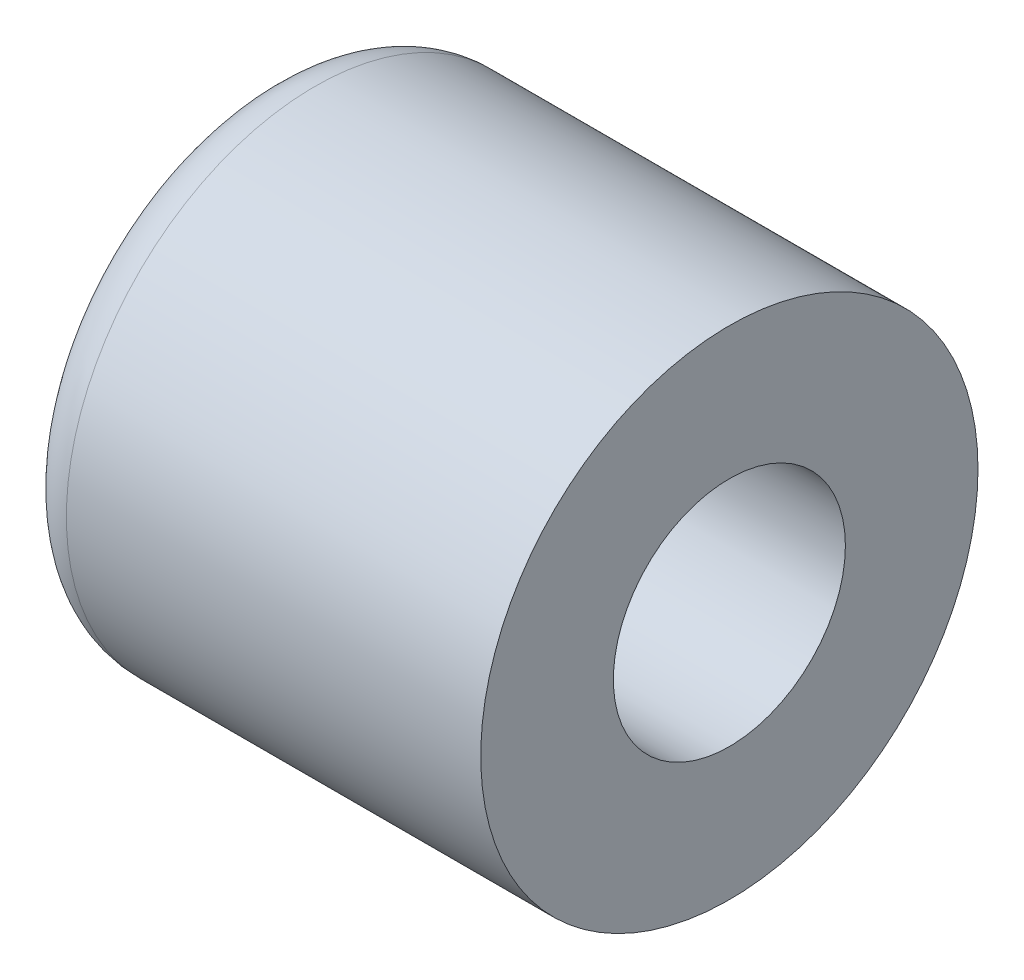
ISO-10303-21;
HEADER;
FILE_DESCRIPTION(('STEP AP214'),'2;1');
FILE_NAME('part.step','',(''),(''),'','','');
FILE_SCHEMA(('AUTOMOTIVE_DESIGN { 1 0 10303 214 1 1 1 1 }'));
ENDSEC;
DATA;
#1=APPLICATION_CONTEXT('core data for automotive mechanical design processes');
#2=APPLICATION_PROTOCOL_DEFINITION('international standard','automotive_design',2000,#1);
#3=PRODUCT_CONTEXT('',#1,'mechanical');
#4=PRODUCT('Part','Part','',(#3));
#5=PRODUCT_RELATED_PRODUCT_CATEGORY('part','',(#4));
#6=PRODUCT_DEFINITION_FORMATION('','',#4);
#7=PRODUCT_DEFINITION_CONTEXT('part definition',#1,'design');
#8=PRODUCT_DEFINITION('design','',#6,#7);
#9=PRODUCT_DEFINITION_SHAPE('','',#8);
#10=(LENGTH_UNIT() NAMED_UNIT(*) SI_UNIT(.MILLI.,.METRE.));
#11=(NAMED_UNIT(*) PLANE_ANGLE_UNIT() SI_UNIT($,.RADIAN.));
#12=(NAMED_UNIT(*) SI_UNIT($,.STERADIAN.) SOLID_ANGLE_UNIT());
#13=UNCERTAINTY_MEASURE_WITH_UNIT(LENGTH_MEASURE(1.E-05),#10,'distance_accuracy_value','');
#14=(GEOMETRIC_REPRESENTATION_CONTEXT(3) GLOBAL_UNCERTAINTY_ASSIGNED_CONTEXT((#13)) GLOBAL_UNIT_ASSIGNED_CONTEXT((#10,
#11,#12)) REPRESENTATION_CONTEXT('',''));
#15=CARTESIAN_POINT('',(0.,0.,0.));
#16=DIRECTION('',(0.,0.,1.));
#17=DIRECTION('',(1.,0.,0.));
#18=AXIS2_PLACEMENT_3D('',#15,#16,#17);
#19=CARTESIAN_POINT('',(7.,0.,0.));
#20=DIRECTION('',(-1.,0.,0.));
#21=DIRECTION('',(0.,0.,1.));
#22=AXIS2_PLACEMENT_3D('',#19,#20,#21);
#23=CYLINDRICAL_SURFACE('',#22,7.5);
#24=CARTESIAN_POINT('',(-5.5,0.,0.));
#25=DIRECTION('',(1.,0.,0.));
#26=DIRECTION('',(0.,0.,-1.));
#27=AXIS2_PLACEMENT_3D('',#24,#25,#26);
#28=CIRCLE('',#27,7.5);
#29=CARTESIAN_POINT('',(-5.5,0.,-7.5));
#30=VERTEX_POINT('',#29);
#31=EDGE_CURVE('E48',#30,#30,#28,.T.);
#32=ORIENTED_EDGE('',*,*,#31,.T.);
#33=EDGE_LOOP('',(#32));
#34=FACE_BOUND('',#33,.T.);
#35=CARTESIAN_POINT('',(7.,0.,0.));
#36=DIRECTION('',(1.,0.,0.));
#37=DIRECTION('',(0.,0.,-1.));
#38=AXIS2_PLACEMENT_3D('',#35,#36,#37);
#39=CIRCLE('',#38,7.5);
#40=CARTESIAN_POINT('',(7.,0.,-7.5));
#41=VERTEX_POINT('',#40);
#42=EDGE_CURVE('E61',#41,#41,#39,.T.);
#43=ORIENTED_EDGE('',*,*,#42,.F.);
#44=EDGE_LOOP('',(#43));
#45=FACE_BOUND('',#44,.T.);
#46=ADVANCED_FACE('F41',(#34,#45),#23,.T.);
#47=CARTESIAN_POINT('',(7.,0.,0.));
#48=DIRECTION('',(1.,0.,0.));
#49=DIRECTION('',(0.,0.,-1.));
#50=AXIS2_PLACEMENT_3D('',#47,#48,#49);
#51=PLANE('',#50);
#52=CARTESIAN_POINT('',(7.,0.,0.));
#53=DIRECTION('',(1.,0.,0.));
#54=DIRECTION('',(0.,0.,-1.));
#55=AXIS2_PLACEMENT_3D('',#52,#53,#54);
#56=CIRCLE('',#55,3.49999999999999);
#57=CARTESIAN_POINT('',(7.,0.,-3.49999999999999));
#58=VERTEX_POINT('',#57);
#59=EDGE_CURVE('E62',#58,#58,#56,.T.);
#60=ORIENTED_EDGE('',*,*,#59,.F.);
#61=EDGE_LOOP('',(#60));
#62=FACE_BOUND('',#61,.T.);
#63=ORIENTED_EDGE('',*,*,#42,.T.);
#64=EDGE_LOOP('',(#63));
#65=FACE_BOUND('',#64,.T.);
#66=ADVANCED_FACE('F81',(#62,#65),#51,.T.);
#67=CARTESIAN_POINT('',(-7.,0.,0.));
#68=DIRECTION('',(1.,0.,0.));
#69=DIRECTION('',(0.,0.,-1.));
#70=AXIS2_PLACEMENT_3D('',#67,#68,#69);
#71=PLANE('',#70);
#72=CARTESIAN_POINT('',(-7.,0.,0.));
#73=DIRECTION('',(1.,0.,0.));
#74=DIRECTION('',(0.,0.,-1.));
#75=AXIS2_PLACEMENT_3D('',#72,#73,#74);
#76=CIRCLE('',#75,6.);
#77=CARTESIAN_POINT('',(-7.,0.,-6.));
#78=VERTEX_POINT('',#77);
#79=EDGE_CURVE('E11',#78,#78,#76,.F.);
#80=ORIENTED_EDGE('',*,*,#79,.T.);
#81=EDGE_LOOP('',(#80));
#82=FACE_BOUND('',#81,.T.);
#83=ADVANCED_FACE('F55',(#82),#71,.F.);
#84=CARTESIAN_POINT('',(-3.,0.,0.));
#85=DIRECTION('',(1.,0.,0.));
#86=DIRECTION('',(0.,0.,-1.));
#87=AXIS2_PLACEMENT_3D('',#84,#85,#86);
#88=CONICAL_SURFACE('',#87,3.5,1.02974425867665);
#89=CARTESIAN_POINT('',(-5.10301216659646,0.,0.));
#90=VERTEX_POINT('',#89);
#91=VERTEX_LOOP('',#90);
#92=FACE_BOUND('',#91,.T.);
#93=CARTESIAN_POINT('',(-3.,0.,0.));
#94=DIRECTION('',(1.,0.,0.));
#95=DIRECTION('',(0.,0.,-1.));
#96=AXIS2_PLACEMENT_3D('',#93,#94,#95);
#97=CIRCLE('',#96,3.5);
#98=CARTESIAN_POINT('',(-3.,0.,-3.5));
#99=VERTEX_POINT('',#98);
#100=EDGE_CURVE('E59',#99,#99,#97,.T.);
#101=ORIENTED_EDGE('',*,*,#100,.T.);
#102=EDGE_LOOP('',(#101));
#103=FACE_BOUND('',#102,.T.);
#104=ADVANCED_FACE('F51',(#92,#103),#88,.F.);
#105=CARTESIAN_POINT('',(7.,0.,0.));
#106=DIRECTION('',(1.,0.,0.));
#107=DIRECTION('',(0.,0.,-1.));
#108=AXIS2_PLACEMENT_3D('',#105,#106,#107);
#109=CYLINDRICAL_SURFACE('',#108,3.49999999999999);
#110=ORIENTED_EDGE('',*,*,#100,.F.);
#111=EDGE_LOOP('',(#110));
#112=FACE_BOUND('',#111,.T.);
#113=ORIENTED_EDGE('',*,*,#59,.T.);
#114=EDGE_LOOP('',(#113));
#115=FACE_BOUND('',#114,.T.);
#116=ADVANCED_FACE('F54',(#112,#115),#109,.F.);
#117=CARTESIAN_POINT('',(-5.5,0.,0.));
#118=DIRECTION('',(1.,0.,0.));
#119=DIRECTION('',(0.,0.,-1.));
#120=AXIS2_PLACEMENT_3D('',#117,#118,#119);
#121=TOROIDAL_SURFACE('',#120,6.,1.5);
#122=ORIENTED_EDGE('',*,*,#79,.F.);
#123=EDGE_LOOP('',(#122));
#124=FACE_BOUND('',#123,.T.);
#125=ORIENTED_EDGE('',*,*,#31,.F.);
#126=EDGE_LOOP('',(#125));
#127=FACE_BOUND('',#126,.T.);
#128=ADVANCED_FACE('F43',(#124,#127),#121,.T.);
#129=CLOSED_SHELL('',(#46,#66,#83,#104,#116,#128));
#130=MANIFOLD_SOLID_BREP('B2',#129);
#131=ADVANCED_BREP_SHAPE_REPRESENTATION('',(#18,#130),#14);
#132=SHAPE_DEFINITION_REPRESENTATION(#9,#131);
ENDSEC;
END-ISO-10303-21;
